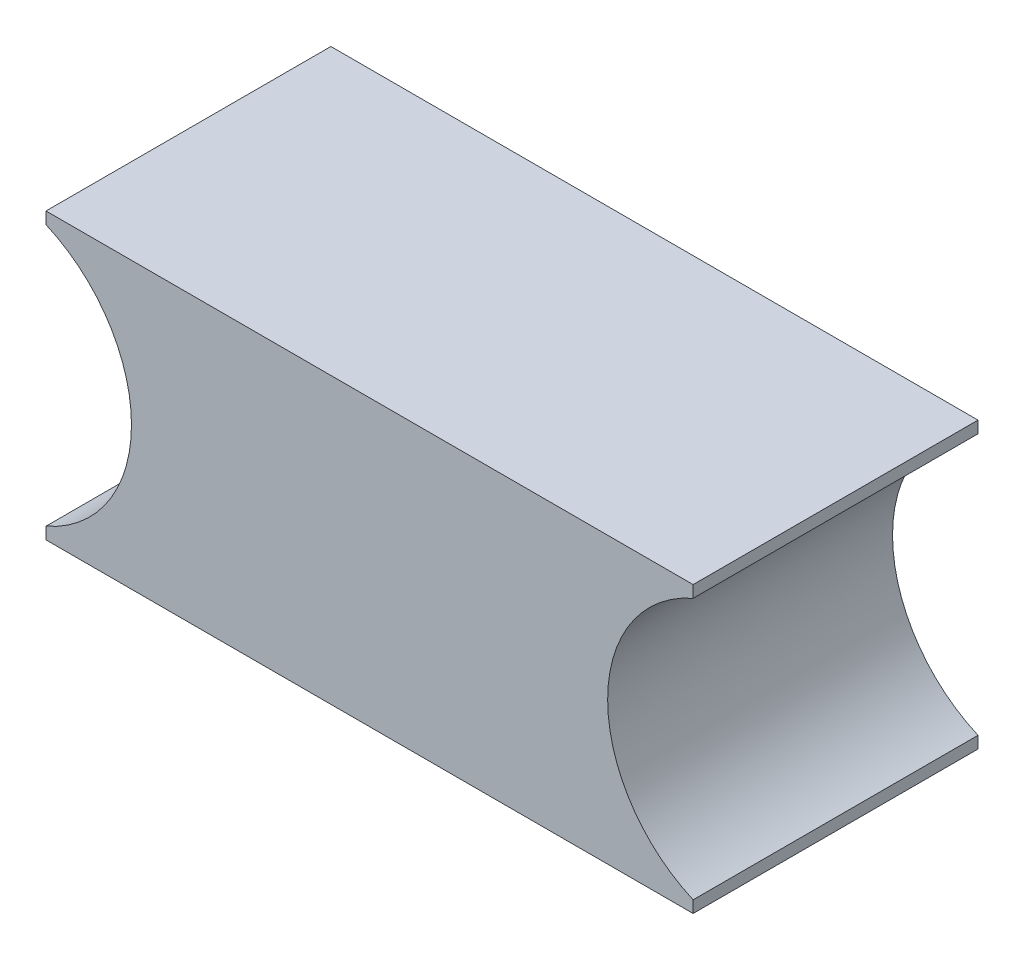
ISO-10303-21;
HEADER;
FILE_DESCRIPTION(('STEP AP214'),'2;1');
FILE_NAME('part.step','',(''),(''),'','','');
FILE_SCHEMA(('AUTOMOTIVE_DESIGN { 1 0 10303 214 1 1 1 1 }'));
ENDSEC;
DATA;
#1=APPLICATION_CONTEXT('core data for automotive mechanical design processes');
#2=APPLICATION_PROTOCOL_DEFINITION('international standard','automotive_design',2000,#1);
#3=PRODUCT_CONTEXT('',#1,'mechanical');
#4=PRODUCT('Part','Part','',(#3));
#5=PRODUCT_RELATED_PRODUCT_CATEGORY('part','',(#4));
#6=PRODUCT_DEFINITION_FORMATION('','',#4);
#7=PRODUCT_DEFINITION_CONTEXT('part definition',#1,'design');
#8=PRODUCT_DEFINITION('design','',#6,#7);
#9=PRODUCT_DEFINITION_SHAPE('','',#8);
#10=(LENGTH_UNIT() NAMED_UNIT(*) SI_UNIT(.MILLI.,.METRE.));
#11=(NAMED_UNIT(*) PLANE_ANGLE_UNIT() SI_UNIT($,.RADIAN.));
#12=(NAMED_UNIT(*) SI_UNIT($,.STERADIAN.) SOLID_ANGLE_UNIT());
#13=UNCERTAINTY_MEASURE_WITH_UNIT(LENGTH_MEASURE(1.E-05),#10,'distance_accuracy_value','');
#14=(GEOMETRIC_REPRESENTATION_CONTEXT(3) GLOBAL_UNCERTAINTY_ASSIGNED_CONTEXT((#13)) GLOBAL_UNIT_ASSIGNED_CONTEXT((#10,
#11,#12)) REPRESENTATION_CONTEXT('',''));
#15=CARTESIAN_POINT('',(0.,0.,0.));
#16=DIRECTION('',(0.,0.,1.));
#17=DIRECTION('',(1.,0.,0.));
#18=AXIS2_PLACEMENT_3D('',#15,#16,#17);
#19=CARTESIAN_POINT('',(-3.62355266812643,-23.2794845303757,50.8));
#20=DIRECTION('',(1.,0.,0.));
#21=DIRECTION('',(0.,1.,0.));
#22=AXIS2_PLACEMENT_3D('',#19,#20,#21);
#23=PLANE('',#22);
#24=DIRECTION('',(0.,-1.,0.));
#25=VECTOR('',#24,1.);
#26=CARTESIAN_POINT('',(-3.62355266812643,-23.2794845303757,0.));
#27=LINE('',#26,#25);
#28=CARTESIAN_POINT('',(-3.62355266812642,-23.2794845303757,0.));
#29=VERTEX_POINT('',#28);
#30=CARTESIAN_POINT('',(-3.62355266812643,-25.4,0.));
#31=VERTEX_POINT('',#30);
#32=EDGE_CURVE('E140',#29,#31,#27,.T.);
#33=ORIENTED_EDGE('',*,*,#32,.T.);
#34=DIRECTION('',(0.,0.,-1.));
#35=VECTOR('',#34,1.);
#36=CARTESIAN_POINT('',(-3.62355266812643,-25.4,50.8));
#37=LINE('',#36,#35);
#38=CARTESIAN_POINT('',(-3.62355266812643,-25.4,50.8));
#39=VERTEX_POINT('',#38);
#40=EDGE_CURVE('E11',#39,#31,#37,.T.);
#41=ORIENTED_EDGE('',*,*,#40,.F.);
#42=DIRECTION('',(0.,-1.,0.));
#43=VECTOR('',#42,1.);
#44=CARTESIAN_POINT('',(-3.62355266812643,-23.2794845303757,50.8));
#45=LINE('',#44,#43);
#46=CARTESIAN_POINT('',(-3.62355266812642,-23.2794845303757,50.8));
#47=VERTEX_POINT('',#46);
#48=EDGE_CURVE('E162',#47,#39,#45,.T.);
#49=ORIENTED_EDGE('',*,*,#48,.F.);
#50=DIRECTION('',(0.,0.,-1.));
#51=VECTOR('',#50,1.);
#52=CARTESIAN_POINT('',(-3.62355266812642,-23.2794845303757,50.8));
#53=LINE('',#52,#51);
#54=EDGE_CURVE('E136',#47,#29,#53,.T.);
#55=ORIENTED_EDGE('',*,*,#54,.T.);
#56=EDGE_LOOP('',(#33,#41,#49,#55));
#57=FACE_BOUND('',#56,.T.);
#58=ADVANCED_FACE('F39',(#57),#23,.F.);
#59=CARTESIAN_POINT('',(111.774314292955,-25.4,50.8));
#60=DIRECTION('',(0.,1.,0.));
#61=DIRECTION('',(0.,0.,1.));
#62=AXIS2_PLACEMENT_3D('',#59,#60,#61);
#63=PLANE('',#62);
#64=DIRECTION('',(1.,0.,0.));
#65=VECTOR('',#64,1.);
#66=CARTESIAN_POINT('',(111.774314292955,-25.4,0.));
#67=LINE('',#66,#65);
#68=CARTESIAN_POINT('',(111.774314292955,-25.4,0.));
#69=VERTEX_POINT('',#68);
#70=EDGE_CURVE('E144',#31,#69,#67,.T.);
#71=ORIENTED_EDGE('',*,*,#70,.T.);
#72=DIRECTION('',(0.,0.,-1.));
#73=VECTOR('',#72,1.);
#74=CARTESIAN_POINT('',(111.774314292955,-25.4,50.8));
#75=LINE('',#74,#73);
#76=CARTESIAN_POINT('',(111.774314292955,-25.4,50.8));
#77=VERTEX_POINT('',#76);
#78=EDGE_CURVE('E48',#77,#69,#75,.T.);
#79=ORIENTED_EDGE('',*,*,#78,.F.);
#80=DIRECTION('',(1.,0.,0.));
#81=VECTOR('',#80,1.);
#82=CARTESIAN_POINT('',(111.774314292955,-25.4,50.8));
#83=LINE('',#82,#81);
#84=EDGE_CURVE('E99',#39,#77,#83,.T.);
#85=ORIENTED_EDGE('',*,*,#84,.F.);
#86=ORIENTED_EDGE('',*,*,#40,.T.);
#87=EDGE_LOOP('',(#71,#79,#85,#86));
#88=FACE_BOUND('',#87,.T.);
#89=ADVANCED_FACE('F208',(#88),#63,.F.);
#90=CARTESIAN_POINT('',(111.774314292955,-23.2794845303757,50.8));
#91=DIRECTION('',(-1.,0.,0.));
#92=DIRECTION('',(0.,0.,1.));
#93=AXIS2_PLACEMENT_3D('',#90,#91,#92);
#94=PLANE('',#93);
#95=DIRECTION('',(0.,1.,0.));
#96=VECTOR('',#95,1.);
#97=CARTESIAN_POINT('',(111.774314292955,-23.2794845303757,0.));
#98=LINE('',#97,#96);
#99=CARTESIAN_POINT('',(111.774314292955,-23.2794845303757,0.));
#100=VERTEX_POINT('',#99);
#101=EDGE_CURVE('E147',#69,#100,#98,.T.);
#102=ORIENTED_EDGE('',*,*,#101,.T.);
#103=DIRECTION('',(0.,0.,-1.));
#104=VECTOR('',#103,1.);
#105=CARTESIAN_POINT('',(111.774314292955,-23.2794845303757,50.8));
#106=LINE('',#105,#104);
#107=CARTESIAN_POINT('',(111.774314292955,-23.2794845303757,50.8));
#108=VERTEX_POINT('',#107);
#109=EDGE_CURVE('E173',#108,#100,#106,.T.);
#110=ORIENTED_EDGE('',*,*,#109,.F.);
#111=DIRECTION('',(0.,1.,0.));
#112=VECTOR('',#111,1.);
#113=CARTESIAN_POINT('',(111.774314292955,-23.2794845303757,50.8));
#114=LINE('',#113,#112);
#115=EDGE_CURVE('E183',#77,#108,#114,.T.);
#116=ORIENTED_EDGE('',*,*,#115,.F.);
#117=ORIENTED_EDGE('',*,*,#78,.T.);
#118=EDGE_LOOP('',(#102,#110,#116,#117));
#119=FACE_BOUND('',#118,.T.);
#120=ADVANCED_FACE('F181',(#119),#94,.F.);
#121=CARTESIAN_POINT('',(121.934314292955,0.,50.8));
#122=DIRECTION('',(0.,0.,-1.));
#123=DIRECTION('',(-1.,0.,0.));
#124=AXIS2_PLACEMENT_3D('',#121,#122,#123);
#125=CYLINDRICAL_SURFACE('',#124,25.4);
#126=CARTESIAN_POINT('',(121.934314292955,0.,0.));
#127=DIRECTION('',(0.,0.,-1.));
#128=DIRECTION('',(1.,0.,0.));
#129=AXIS2_PLACEMENT_3D('',#126,#127,#128);
#130=CIRCLE('',#129,25.4);
#131=CARTESIAN_POINT('',(111.774314292955,23.2794845303757,0.));
#132=VERTEX_POINT('',#131);
#133=EDGE_CURVE('E150',#100,#132,#130,.T.);
#134=ORIENTED_EDGE('',*,*,#133,.T.);
#135=DIRECTION('',(0.,0.,-1.));
#136=VECTOR('',#135,1.);
#137=CARTESIAN_POINT('',(111.774314292955,23.2794845303757,50.8));
#138=LINE('',#137,#136);
#139=CARTESIAN_POINT('',(111.774314292955,23.2794845303757,50.8));
#140=VERTEX_POINT('',#139);
#141=EDGE_CURVE('E169',#140,#132,#138,.T.);
#142=ORIENTED_EDGE('',*,*,#141,.F.);
#143=CARTESIAN_POINT('',(121.934314292955,0.,50.8));
#144=DIRECTION('',(0.,0.,-1.));
#145=DIRECTION('',(1.,0.,0.));
#146=AXIS2_PLACEMENT_3D('',#143,#144,#145);
#147=CIRCLE('',#146,25.4);
#148=EDGE_CURVE('E196',#108,#140,#147,.T.);
#149=ORIENTED_EDGE('',*,*,#148,.F.);
#150=ORIENTED_EDGE('',*,*,#109,.T.);
#151=EDGE_LOOP('',(#134,#142,#149,#150));
#152=FACE_BOUND('',#151,.T.);
#153=ADVANCED_FACE('F191',(#152),#125,.F.);
#154=CARTESIAN_POINT('',(111.774314292955,25.4,50.8));
#155=DIRECTION('',(-1.,0.,0.));
#156=DIRECTION('',(0.,0.,1.));
#157=AXIS2_PLACEMENT_3D('',#154,#155,#156);
#158=PLANE('',#157);
#159=DIRECTION('',(0.,1.,0.));
#160=VECTOR('',#159,1.);
#161=CARTESIAN_POINT('',(111.774314292955,25.4,0.));
#162=LINE('',#161,#160);
#163=CARTESIAN_POINT('',(111.774314292955,25.4,0.));
#164=VERTEX_POINT('',#163);
#165=EDGE_CURVE('E153',#132,#164,#162,.T.);
#166=ORIENTED_EDGE('',*,*,#165,.T.);
#167=DIRECTION('',(0.,0.,-1.));
#168=VECTOR('',#167,1.);
#169=CARTESIAN_POINT('',(111.774314292955,25.4,50.8));
#170=LINE('',#169,#168);
#171=CARTESIAN_POINT('',(111.774314292955,25.4,50.8));
#172=VERTEX_POINT('',#171);
#173=EDGE_CURVE('E129',#172,#164,#170,.T.);
#174=ORIENTED_EDGE('',*,*,#173,.F.);
#175=DIRECTION('',(0.,1.,0.));
#176=VECTOR('',#175,1.);
#177=CARTESIAN_POINT('',(111.774314292955,25.4,50.8));
#178=LINE('',#177,#176);
#179=EDGE_CURVE('E118',#140,#172,#178,.T.);
#180=ORIENTED_EDGE('',*,*,#179,.F.);
#181=ORIENTED_EDGE('',*,*,#141,.T.);
#182=EDGE_LOOP('',(#166,#174,#180,#181));
#183=FACE_BOUND('',#182,.T.);
#184=ADVANCED_FACE('F194',(#183),#158,.F.);
#185=CARTESIAN_POINT('',(-3.62355266812642,25.4,50.8));
#186=DIRECTION('',(0.,-1.,0.));
#187=DIRECTION('',(0.,0.,-1.));
#188=AXIS2_PLACEMENT_3D('',#185,#186,#187);
#189=PLANE('',#188);
#190=DIRECTION('',(-1.,0.,0.));
#191=VECTOR('',#190,1.);
#192=CARTESIAN_POINT('',(-3.62355266812642,25.4,0.));
#193=LINE('',#192,#191);
#194=CARTESIAN_POINT('',(-3.62355266812642,25.4,0.));
#195=VERTEX_POINT('',#194);
#196=EDGE_CURVE('E127',#164,#195,#193,.T.);
#197=ORIENTED_EDGE('',*,*,#196,.T.);
#198=DIRECTION('',(0.,0.,-1.));
#199=VECTOR('',#198,1.);
#200=CARTESIAN_POINT('',(-3.62355266812642,25.4,50.8));
#201=LINE('',#200,#199);
#202=CARTESIAN_POINT('',(-3.62355266812642,25.4,50.8));
#203=VERTEX_POINT('',#202);
#204=EDGE_CURVE('E124',#203,#195,#201,.T.);
#205=ORIENTED_EDGE('',*,*,#204,.F.);
#206=DIRECTION('',(-1.,0.,0.));
#207=VECTOR('',#206,1.);
#208=CARTESIAN_POINT('',(-3.62355266812642,25.4,50.8));
#209=LINE('',#208,#207);
#210=EDGE_CURVE('E112',#172,#203,#209,.T.);
#211=ORIENTED_EDGE('',*,*,#210,.F.);
#212=ORIENTED_EDGE('',*,*,#173,.T.);
#213=EDGE_LOOP('',(#197,#205,#211,#212));
#214=FACE_BOUND('',#213,.T.);
#215=ADVANCED_FACE('F125',(#214),#189,.F.);
#216=CARTESIAN_POINT('',(-3.62355266812642,25.4,50.8));
#217=DIRECTION('',(1.,0.,0.));
#218=DIRECTION('',(0.,0.,-1.));
#219=AXIS2_PLACEMENT_3D('',#216,#217,#218);
#220=PLANE('',#219);
#221=DIRECTION('',(0.,-1.,0.));
#222=VECTOR('',#221,1.);
#223=CARTESIAN_POINT('',(-3.62355266812642,25.4,0.));
#224=LINE('',#223,#222);
#225=CARTESIAN_POINT('',(-3.62355266812642,23.2794845303757,0.));
#226=VERTEX_POINT('',#225);
#227=EDGE_CURVE('E85',#195,#226,#224,.T.);
#228=ORIENTED_EDGE('',*,*,#227,.T.);
#229=DIRECTION('',(0.,0.,-1.));
#230=VECTOR('',#229,1.);
#231=CARTESIAN_POINT('',(-3.62355266812642,23.2794845303757,50.8));
#232=LINE('',#231,#230);
#233=CARTESIAN_POINT('',(-3.62355266812642,23.2794845303757,50.8));
#234=VERTEX_POINT('',#233);
#235=EDGE_CURVE('E130',#234,#226,#232,.T.);
#236=ORIENTED_EDGE('',*,*,#235,.F.);
#237=DIRECTION('',(0.,-1.,0.));
#238=VECTOR('',#237,1.);
#239=CARTESIAN_POINT('',(-3.62355266812642,25.4,50.8));
#240=LINE('',#239,#238);
#241=EDGE_CURVE('E116',#203,#234,#240,.T.);
#242=ORIENTED_EDGE('',*,*,#241,.F.);
#243=ORIENTED_EDGE('',*,*,#204,.T.);
#244=EDGE_LOOP('',(#228,#236,#242,#243));
#245=FACE_BOUND('',#244,.T.);
#246=ADVANCED_FACE('F132',(#245),#220,.F.);
#247=CARTESIAN_POINT('',(-13.7835526681264,0.,50.8));
#248=DIRECTION('',(0.,0.,-1.));
#249=DIRECTION('',(-1.,0.,0.));
#250=AXIS2_PLACEMENT_3D('',#247,#248,#249);
#251=CYLINDRICAL_SURFACE('',#250,25.4);
#252=CARTESIAN_POINT('',(-13.7835526681264,0.,0.));
#253=DIRECTION('',(0.,0.,-1.));
#254=DIRECTION('',(-1.,0.,0.));
#255=AXIS2_PLACEMENT_3D('',#252,#253,#254);
#256=CIRCLE('',#255,25.4);
#257=EDGE_CURVE('E91',#226,#29,#256,.T.);
#258=ORIENTED_EDGE('',*,*,#257,.T.);
#259=ORIENTED_EDGE('',*,*,#54,.F.);
#260=CARTESIAN_POINT('',(-13.7835526681264,0.,50.8));
#261=DIRECTION('',(0.,0.,-1.));
#262=DIRECTION('',(-1.,0.,0.));
#263=AXIS2_PLACEMENT_3D('',#260,#261,#262);
#264=CIRCLE('',#263,25.4);
#265=EDGE_CURVE('E56',#234,#47,#264,.T.);
#266=ORIENTED_EDGE('',*,*,#265,.F.);
#267=ORIENTED_EDGE('',*,*,#235,.T.);
#268=EDGE_LOOP('',(#258,#259,#266,#267));
#269=FACE_BOUND('',#268,.T.);
#270=ADVANCED_FACE('F224',(#269),#251,.F.);
#271=CARTESIAN_POINT('',(121.934314292955,0.,50.8));
#272=DIRECTION('',(0.,0.,1.));
#273=DIRECTION('',(1.,0.,0.));
#274=AXIS2_PLACEMENT_3D('',#271,#272,#273);
#275=PLANE('',#274);
#276=ORIENTED_EDGE('',*,*,#48,.T.);
#277=ORIENTED_EDGE('',*,*,#84,.T.);
#278=ORIENTED_EDGE('',*,*,#115,.T.);
#279=ORIENTED_EDGE('',*,*,#148,.T.);
#280=ORIENTED_EDGE('',*,*,#179,.T.);
#281=ORIENTED_EDGE('',*,*,#210,.T.);
#282=ORIENTED_EDGE('',*,*,#241,.T.);
#283=ORIENTED_EDGE('',*,*,#265,.T.);
#284=EDGE_LOOP('',(#276,#277,#278,#279,#280,#281,#282,#283));
#285=FACE_BOUND('',#284,.T.);
#286=ADVANCED_FACE('F114',(#285),#275,.T.);
#287=CARTESIAN_POINT('',(121.934314292955,0.,0.));
#288=DIRECTION('',(0.,0.,1.));
#289=DIRECTION('',(1.,0.,0.));
#290=AXIS2_PLACEMENT_3D('',#287,#288,#289);
#291=PLANE('',#290);
#292=ORIENTED_EDGE('',*,*,#32,.F.);
#293=ORIENTED_EDGE('',*,*,#257,.F.);
#294=ORIENTED_EDGE('',*,*,#227,.F.);
#295=ORIENTED_EDGE('',*,*,#196,.F.);
#296=ORIENTED_EDGE('',*,*,#165,.F.);
#297=ORIENTED_EDGE('',*,*,#133,.F.);
#298=ORIENTED_EDGE('',*,*,#101,.F.);
#299=ORIENTED_EDGE('',*,*,#70,.F.);
#300=EDGE_LOOP('',(#292,#293,#294,#295,#296,#297,#298,#299));
#301=FACE_BOUND('',#300,.T.);
#302=ADVANCED_FACE('F187',(#301),#291,.F.);
#303=CLOSED_SHELL('',(#58,#89,#120,#153,#184,#215,#246,#270,#286,#302));
#304=MANIFOLD_SOLID_BREP('B2',#303);
#305=ADVANCED_BREP_SHAPE_REPRESENTATION('',(#18,#304),#14);
#306=SHAPE_DEFINITION_REPRESENTATION(#9,#305);
ENDSEC;
END-ISO-10303-21;
